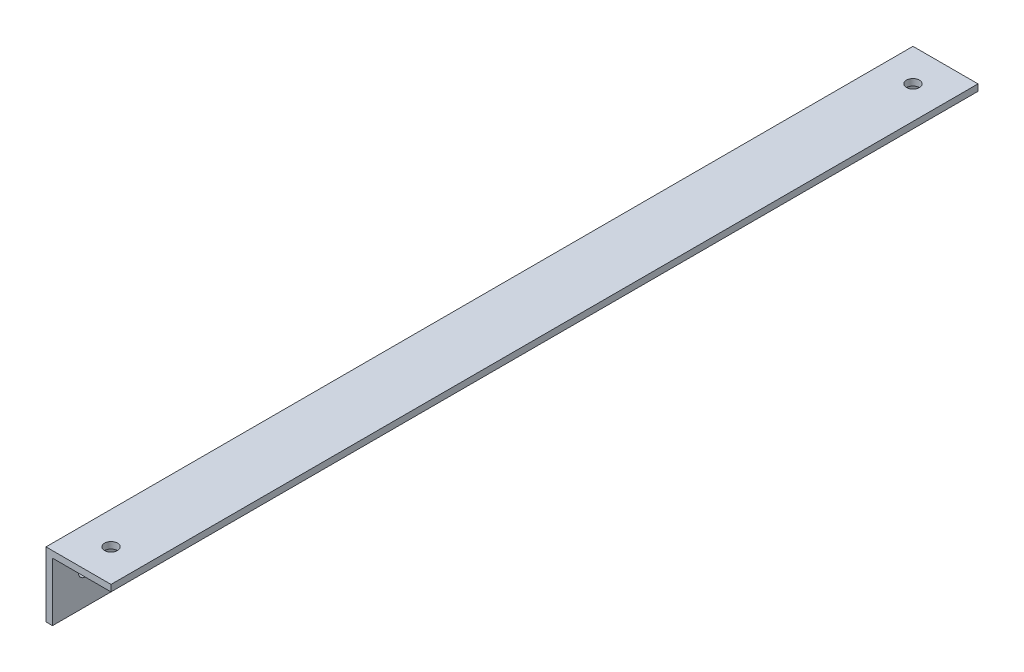
ISO-10303-21;
HEADER;
FILE_DESCRIPTION(('STEP AP214'),'2;1');
FILE_NAME('part.step','',(''),(''),'','','');
FILE_SCHEMA(('AUTOMOTIVE_DESIGN { 1 0 10303 214 1 1 1 1 }'));
ENDSEC;
DATA;
#1=APPLICATION_CONTEXT('core data for automotive mechanical design processes');
#2=APPLICATION_PROTOCOL_DEFINITION('international standard','automotive_design',2000,#1);
#3=PRODUCT_CONTEXT('',#1,'mechanical');
#4=PRODUCT('Part','Part','',(#3));
#5=PRODUCT_RELATED_PRODUCT_CATEGORY('part','',(#4));
#6=PRODUCT_DEFINITION_FORMATION('','',#4);
#7=PRODUCT_DEFINITION_CONTEXT('part definition',#1,'design');
#8=PRODUCT_DEFINITION('design','',#6,#7);
#9=PRODUCT_DEFINITION_SHAPE('','',#8);
#10=(LENGTH_UNIT() NAMED_UNIT(*) SI_UNIT(.MILLI.,.METRE.));
#11=(NAMED_UNIT(*) PLANE_ANGLE_UNIT() SI_UNIT($,.RADIAN.));
#12=(NAMED_UNIT(*) SI_UNIT($,.STERADIAN.) SOLID_ANGLE_UNIT());
#13=UNCERTAINTY_MEASURE_WITH_UNIT(LENGTH_MEASURE(1.E-05),#10,'distance_accuracy_value','');
#14=(GEOMETRIC_REPRESENTATION_CONTEXT(3) GLOBAL_UNCERTAINTY_ASSIGNED_CONTEXT((#13)) GLOBAL_UNIT_ASSIGNED_CONTEXT((#10,
#11,#12)) REPRESENTATION_CONTEXT('',''));
#15=CARTESIAN_POINT('',(0.,0.,0.));
#16=DIRECTION('',(0.,0.,1.));
#17=DIRECTION('',(1.,0.,0.));
#18=AXIS2_PLACEMENT_3D('',#15,#16,#17);
#19=CARTESIAN_POINT('',(-30.,0.,400.));
#20=DIRECTION('',(1.,0.,0.));
#21=DIRECTION('',(0.,0.,-1.));
#22=AXIS2_PLACEMENT_3D('',#19,#20,#21);
#23=PLANE('',#22);
#24=CARTESIAN_POINT('',(-30.,-12.,385.));
#25=DIRECTION('',(-1.,0.,0.));
#26=DIRECTION('',(0.,0.,1.));
#27=AXIS2_PLACEMENT_3D('',#24,#25,#26);
#28=CIRCLE('',#27,3.);
#29=CARTESIAN_POINT('',(-30.,-12.,388.));
#30=VERTEX_POINT('',#29);
#31=EDGE_CURVE('E147',#30,#30,#28,.T.);
#32=ORIENTED_EDGE('',*,*,#31,.F.);
#33=EDGE_LOOP('',(#32));
#34=FACE_BOUND('',#33,.T.);
#35=CARTESIAN_POINT('',(-30.,-12.,15.));
#36=DIRECTION('',(-1.,0.,0.));
#37=DIRECTION('',(0.,0.,1.));
#38=AXIS2_PLACEMENT_3D('',#35,#36,#37);
#39=CIRCLE('',#38,3.);
#40=CARTESIAN_POINT('',(-30.,-12.,18.));
#41=VERTEX_POINT('',#40);
#42=EDGE_CURVE('E136',#41,#41,#39,.T.);
#43=ORIENTED_EDGE('',*,*,#42,.F.);
#44=EDGE_LOOP('',(#43));
#45=FACE_BOUND('',#44,.T.);
#46=DIRECTION('',(0.,1.,0.));
#47=VECTOR('',#46,1.);
#48=CARTESIAN_POINT('',(-30.,0.,0.));
#49=LINE('',#48,#47);
#50=CARTESIAN_POINT('',(-30.,3.,0.));
#51=VERTEX_POINT('',#50);
#52=CARTESIAN_POINT('',(-30.,-27.,0.));
#53=VERTEX_POINT('',#52);
#54=EDGE_CURVE('E116',#51,#53,#49,.F.);
#55=ORIENTED_EDGE('',*,*,#54,.T.);
#56=DIRECTION('',(0.,0.,-1.));
#57=VECTOR('',#56,1.);
#58=CARTESIAN_POINT('',(-30.,-27.,400.));
#59=LINE('',#58,#57);
#60=CARTESIAN_POINT('',(-30.,-27.,400.));
#61=VERTEX_POINT('',#60);
#62=EDGE_CURVE('E11',#61,#53,#59,.T.);
#63=ORIENTED_EDGE('',*,*,#62,.F.);
#64=DIRECTION('',(0.,1.,0.));
#65=VECTOR('',#64,1.);
#66=CARTESIAN_POINT('',(-30.,0.,400.));
#67=LINE('',#66,#65);
#68=CARTESIAN_POINT('',(-30.,3.,400.));
#69=VERTEX_POINT('',#68);
#70=EDGE_CURVE('E81',#69,#61,#67,.F.);
#71=ORIENTED_EDGE('',*,*,#70,.F.);
#72=DIRECTION('',(0.,0.,-1.));
#73=VECTOR('',#72,1.);
#74=CARTESIAN_POINT('',(-30.,3.,400.));
#75=LINE('',#74,#73);
#76=EDGE_CURVE('E112',#69,#51,#75,.T.);
#77=ORIENTED_EDGE('',*,*,#76,.T.);
#78=EDGE_LOOP('',(#55,#63,#71,#77));
#79=FACE_BOUND('',#78,.T.);
#80=ADVANCED_FACE('F33',(#34,#45,#79),#23,.F.);
#81=CARTESIAN_POINT('',(-27.,-27.,400.));
#82=DIRECTION('',(0.,-1.,0.));
#83=DIRECTION('',(0.,0.,-1.));
#84=AXIS2_PLACEMENT_3D('',#81,#82,#83);
#85=PLANE('',#84);
#86=DIRECTION('',(-1.,0.,0.));
#87=VECTOR('',#86,1.);
#88=CARTESIAN_POINT('',(-27.,-27.,0.));
#89=LINE('',#88,#87);
#90=CARTESIAN_POINT('',(-27.,-27.,0.));
#91=VERTEX_POINT('',#90);
#92=EDGE_CURVE('E119',#91,#53,#89,.T.);
#93=ORIENTED_EDGE('',*,*,#92,.F.);
#94=DIRECTION('',(0.,0.,-1.));
#95=VECTOR('',#94,1.);
#96=CARTESIAN_POINT('',(-27.,-27.,400.));
#97=LINE('',#96,#95);
#98=CARTESIAN_POINT('',(-27.,-27.,400.));
#99=VERTEX_POINT('',#98);
#100=EDGE_CURVE('E42',#99,#91,#97,.T.);
#101=ORIENTED_EDGE('',*,*,#100,.F.);
#102=DIRECTION('',(-1.,0.,0.));
#103=VECTOR('',#102,1.);
#104=CARTESIAN_POINT('',(-27.,-27.,400.));
#105=LINE('',#104,#103);
#106=EDGE_CURVE('E158',#99,#61,#105,.T.);
#107=ORIENTED_EDGE('',*,*,#106,.T.);
#108=ORIENTED_EDGE('',*,*,#62,.T.);
#109=EDGE_LOOP('',(#93,#101,#107,#108));
#110=FACE_BOUND('',#109,.T.);
#111=ADVANCED_FACE('F182',(#110),#85,.T.);
#112=CARTESIAN_POINT('',(-27.,0.,400.));
#113=DIRECTION('',(1.,0.,0.));
#114=DIRECTION('',(0.,0.,-1.));
#115=AXIS2_PLACEMENT_3D('',#112,#113,#114);
#116=PLANE('',#115);
#117=CARTESIAN_POINT('',(-27.,-12.,385.));
#118=DIRECTION('',(1.,0.,0.));
#119=DIRECTION('',(0.,0.,-1.));
#120=AXIS2_PLACEMENT_3D('',#117,#118,#119);
#121=CIRCLE('',#120,3.);
#122=CARTESIAN_POINT('',(-27.,-12.,382.));
#123=VERTEX_POINT('',#122);
#124=EDGE_CURVE('E36',#123,#123,#121,.T.);
#125=ORIENTED_EDGE('',*,*,#124,.F.);
#126=EDGE_LOOP('',(#125));
#127=FACE_BOUND('',#126,.T.);
#128=CARTESIAN_POINT('',(-27.,-12.,15.));
#129=DIRECTION('',(1.,0.,0.));
#130=DIRECTION('',(0.,0.,-1.));
#131=AXIS2_PLACEMENT_3D('',#128,#129,#130);
#132=CIRCLE('',#131,3.);
#133=CARTESIAN_POINT('',(-27.,-12.,12.));
#134=VERTEX_POINT('',#133);
#135=EDGE_CURVE('E133',#134,#134,#132,.T.);
#136=ORIENTED_EDGE('',*,*,#135,.F.);
#137=EDGE_LOOP('',(#136));
#138=FACE_BOUND('',#137,.T.);
#139=DIRECTION('',(0.,-1.,0.));
#140=VECTOR('',#139,1.);
#141=CARTESIAN_POINT('',(-27.,0.,0.));
#142=LINE('',#141,#140);
#143=CARTESIAN_POINT('',(-27.,0.,0.));
#144=VERTEX_POINT('',#143);
#145=EDGE_CURVE('E123',#144,#91,#142,.T.);
#146=ORIENTED_EDGE('',*,*,#145,.F.);
#147=DIRECTION('',(0.,0.,-1.));
#148=VECTOR('',#147,1.);
#149=CARTESIAN_POINT('',(-27.,0.,400.));
#150=LINE('',#149,#148);
#151=CARTESIAN_POINT('',(-27.,0.,400.));
#152=VERTEX_POINT('',#151);
#153=EDGE_CURVE('E102',#152,#144,#150,.T.);
#154=ORIENTED_EDGE('',*,*,#153,.F.);
#155=DIRECTION('',(0.,-1.,0.));
#156=VECTOR('',#155,1.);
#157=CARTESIAN_POINT('',(-27.,0.,400.));
#158=LINE('',#157,#156);
#159=EDGE_CURVE('E108',#152,#99,#158,.T.);
#160=ORIENTED_EDGE('',*,*,#159,.T.);
#161=ORIENTED_EDGE('',*,*,#100,.T.);
#162=EDGE_LOOP('',(#146,#154,#160,#161));
#163=FACE_BOUND('',#162,.T.);
#164=ADVANCED_FACE('F162',(#127,#138,#163),#116,.T.);
#165=CARTESIAN_POINT('',(0.,0.,400.));
#166=DIRECTION('',(0.,-1.,0.));
#167=DIRECTION('',(0.,0.,-1.));
#168=AXIS2_PLACEMENT_3D('',#165,#166,#167);
#169=PLANE('',#168);
#170=CARTESIAN_POINT('',(-15.,0.,385.));
#171=DIRECTION('',(0.,-1.,0.));
#172=DIRECTION('',(0.,0.,-1.));
#173=AXIS2_PLACEMENT_3D('',#170,#171,#172);
#174=CIRCLE('',#173,3.);
#175=CARTESIAN_POINT('',(-15.,0.,382.));
#176=VERTEX_POINT('',#175);
#177=EDGE_CURVE('E140',#176,#176,#174,.T.);
#178=ORIENTED_EDGE('',*,*,#177,.F.);
#179=EDGE_LOOP('',(#178));
#180=FACE_BOUND('',#179,.T.);
#181=CARTESIAN_POINT('',(-15.,0.,15.));
#182=DIRECTION('',(0.,-1.,0.));
#183=DIRECTION('',(0.,0.,-1.));
#184=AXIS2_PLACEMENT_3D('',#181,#182,#183);
#185=CIRCLE('',#184,3.);
#186=CARTESIAN_POINT('',(-15.,0.,12.));
#187=VERTEX_POINT('',#186);
#188=EDGE_CURVE('E120',#187,#187,#185,.T.);
#189=ORIENTED_EDGE('',*,*,#188,.F.);
#190=EDGE_LOOP('',(#189));
#191=FACE_BOUND('',#190,.T.);
#192=DIRECTION('',(-1.,0.,0.));
#193=VECTOR('',#192,1.);
#194=CARTESIAN_POINT('',(0.,0.,0.));
#195=LINE('',#194,#193);
#196=CARTESIAN_POINT('',(0.,0.,0.));
#197=VERTEX_POINT('',#196);
#198=EDGE_CURVE('E97',#197,#144,#195,.T.);
#199=ORIENTED_EDGE('',*,*,#198,.F.);
#200=DIRECTION('',(0.,0.,-1.));
#201=VECTOR('',#200,1.);
#202=CARTESIAN_POINT('',(0.,0.,400.));
#203=LINE('',#202,#201);
#204=CARTESIAN_POINT('',(0.,0.,400.));
#205=VERTEX_POINT('',#204);
#206=EDGE_CURVE('E92',#205,#197,#203,.T.);
#207=ORIENTED_EDGE('',*,*,#206,.F.);
#208=DIRECTION('',(-1.,0.,0.));
#209=VECTOR('',#208,1.);
#210=CARTESIAN_POINT('',(0.,0.,400.));
#211=LINE('',#210,#209);
#212=EDGE_CURVE('E95',#205,#152,#211,.T.);
#213=ORIENTED_EDGE('',*,*,#212,.T.);
#214=ORIENTED_EDGE('',*,*,#153,.T.);
#215=EDGE_LOOP('',(#199,#207,#213,#214));
#216=FACE_BOUND('',#215,.T.);
#217=ADVANCED_FACE('F94',(#180,#191,#216),#169,.T.);
#218=CARTESIAN_POINT('',(0.,3.,400.));
#219=DIRECTION('',(1.,0.,0.));
#220=DIRECTION('',(0.,0.,-1.));
#221=AXIS2_PLACEMENT_3D('',#218,#219,#220);
#222=PLANE('',#221);
#223=DIRECTION('',(0.,-1.,0.));
#224=VECTOR('',#223,1.);
#225=CARTESIAN_POINT('',(0.,3.,0.));
#226=LINE('',#225,#224);
#227=CARTESIAN_POINT('',(0.,3.,0.));
#228=VERTEX_POINT('',#227);
#229=EDGE_CURVE('E127',#228,#197,#226,.T.);
#230=ORIENTED_EDGE('',*,*,#229,.F.);
#231=DIRECTION('',(0.,0.,-1.));
#232=VECTOR('',#231,1.);
#233=CARTESIAN_POINT('',(0.,3.,400.));
#234=LINE('',#233,#232);
#235=CARTESIAN_POINT('',(0.,3.,400.));
#236=VERTEX_POINT('',#235);
#237=EDGE_CURVE('E72',#236,#228,#234,.T.);
#238=ORIENTED_EDGE('',*,*,#237,.F.);
#239=DIRECTION('',(0.,-1.,0.));
#240=VECTOR('',#239,1.);
#241=CARTESIAN_POINT('',(0.,3.,400.));
#242=LINE('',#241,#240);
#243=EDGE_CURVE('E106',#236,#205,#242,.T.);
#244=ORIENTED_EDGE('',*,*,#243,.T.);
#245=ORIENTED_EDGE('',*,*,#206,.T.);
#246=EDGE_LOOP('',(#230,#238,#244,#245));
#247=FACE_BOUND('',#246,.T.);
#248=ADVANCED_FACE('F110',(#247),#222,.T.);
#249=CARTESIAN_POINT('',(0.,3.,400.));
#250=DIRECTION('',(0.,-1.,0.));
#251=DIRECTION('',(0.,0.,-1.));
#252=AXIS2_PLACEMENT_3D('',#249,#250,#251);
#253=PLANE('',#252);
#254=CARTESIAN_POINT('',(-15.,3.,385.));
#255=DIRECTION('',(0.,1.,0.));
#256=DIRECTION('',(0.,0.,1.));
#257=AXIS2_PLACEMENT_3D('',#254,#255,#256);
#258=CIRCLE('',#257,3.);
#259=CARTESIAN_POINT('',(-15.,3.,388.));
#260=VERTEX_POINT('',#259);
#261=EDGE_CURVE('E135',#260,#260,#258,.T.);
#262=ORIENTED_EDGE('',*,*,#261,.F.);
#263=EDGE_LOOP('',(#262));
#264=FACE_BOUND('',#263,.T.);
#265=CARTESIAN_POINT('',(-15.,3.,15.));
#266=DIRECTION('',(0.,1.,0.));
#267=DIRECTION('',(0.,0.,1.));
#268=AXIS2_PLACEMENT_3D('',#265,#266,#267);
#269=CIRCLE('',#268,3.);
#270=CARTESIAN_POINT('',(-15.,3.,18.));
#271=VERTEX_POINT('',#270);
#272=EDGE_CURVE('E152',#271,#271,#269,.T.);
#273=ORIENTED_EDGE('',*,*,#272,.F.);
#274=EDGE_LOOP('',(#273));
#275=FACE_BOUND('',#274,.T.);
#276=DIRECTION('',(1.,0.,0.));
#277=VECTOR('',#276,1.);
#278=CARTESIAN_POINT('',(0.,3.,0.));
#279=LINE('',#278,#277);
#280=EDGE_CURVE('E75',#228,#51,#279,.F.);
#281=ORIENTED_EDGE('',*,*,#280,.T.);
#282=ORIENTED_EDGE('',*,*,#76,.F.);
#283=DIRECTION('',(1.,0.,0.));
#284=VECTOR('',#283,1.);
#285=CARTESIAN_POINT('',(0.,3.,400.));
#286=LINE('',#285,#284);
#287=EDGE_CURVE('E51',#236,#69,#286,.F.);
#288=ORIENTED_EDGE('',*,*,#287,.F.);
#289=ORIENTED_EDGE('',*,*,#237,.T.);
#290=EDGE_LOOP('',(#281,#282,#288,#289));
#291=FACE_BOUND('',#290,.T.);
#292=ADVANCED_FACE('F168',(#264,#275,#291),#253,.F.);
#293=CARTESIAN_POINT('',(0.,0.,400.));
#294=DIRECTION('',(0.,0.,1.));
#295=DIRECTION('',(1.,0.,0.));
#296=AXIS2_PLACEMENT_3D('',#293,#294,#295);
#297=PLANE('',#296);
#298=ORIENTED_EDGE('',*,*,#70,.T.);
#299=ORIENTED_EDGE('',*,*,#106,.F.);
#300=ORIENTED_EDGE('',*,*,#159,.F.);
#301=ORIENTED_EDGE('',*,*,#212,.F.);
#302=ORIENTED_EDGE('',*,*,#243,.F.);
#303=ORIENTED_EDGE('',*,*,#287,.T.);
#304=EDGE_LOOP('',(#298,#299,#300,#301,#302,#303));
#305=FACE_BOUND('',#304,.T.);
#306=ADVANCED_FACE('F105',(#305),#297,.T.);
#307=CARTESIAN_POINT('',(0.,0.,0.));
#308=DIRECTION('',(0.,0.,1.));
#309=DIRECTION('',(1.,0.,0.));
#310=AXIS2_PLACEMENT_3D('',#307,#308,#309);
#311=PLANE('',#310);
#312=ORIENTED_EDGE('',*,*,#54,.F.);
#313=ORIENTED_EDGE('',*,*,#280,.F.);
#314=ORIENTED_EDGE('',*,*,#229,.T.);
#315=ORIENTED_EDGE('',*,*,#198,.T.);
#316=ORIENTED_EDGE('',*,*,#145,.T.);
#317=ORIENTED_EDGE('',*,*,#92,.T.);
#318=EDGE_LOOP('',(#312,#313,#314,#315,#316,#317));
#319=FACE_BOUND('',#318,.T.);
#320=ADVANCED_FACE('F166',(#319),#311,.F.);
#321=CARTESIAN_POINT('',(-15.,-7.,15.));
#322=DIRECTION('',(0.,1.,0.));
#323=DIRECTION('',(0.,0.,1.));
#324=AXIS2_PLACEMENT_3D('',#321,#322,#323);
#325=CYLINDRICAL_SURFACE('',#324,3.);
#326=ORIENTED_EDGE('',*,*,#188,.T.);
#327=EDGE_LOOP('',(#326));
#328=FACE_BOUND('',#327,.T.);
#329=ORIENTED_EDGE('',*,*,#272,.T.);
#330=EDGE_LOOP('',(#329));
#331=FACE_BOUND('',#330,.T.);
#332=ADVANCED_FACE('F205',(#328,#331),#325,.F.);
#333=CARTESIAN_POINT('',(-15.,-7.,385.));
#334=DIRECTION('',(0.,1.,0.));
#335=DIRECTION('',(0.,0.,1.));
#336=AXIS2_PLACEMENT_3D('',#333,#334,#335);
#337=CYLINDRICAL_SURFACE('',#336,3.);
#338=ORIENTED_EDGE('',*,*,#177,.T.);
#339=EDGE_LOOP('',(#338));
#340=FACE_BOUND('',#339,.T.);
#341=ORIENTED_EDGE('',*,*,#261,.T.);
#342=EDGE_LOOP('',(#341));
#343=FACE_BOUND('',#342,.T.);
#344=ADVANCED_FACE('F200',(#340,#343),#337,.F.);
#345=CARTESIAN_POINT('',(-20.,-12.,15.));
#346=DIRECTION('',(-1.,0.,0.));
#347=DIRECTION('',(0.,0.,1.));
#348=AXIS2_PLACEMENT_3D('',#345,#346,#347);
#349=CYLINDRICAL_SURFACE('',#348,3.);
#350=ORIENTED_EDGE('',*,*,#135,.T.);
#351=EDGE_LOOP('',(#350));
#352=FACE_BOUND('',#351,.T.);
#353=ORIENTED_EDGE('',*,*,#42,.T.);
#354=EDGE_LOOP('',(#353));
#355=FACE_BOUND('',#354,.T.);
#356=ADVANCED_FACE('F194',(#352,#355),#349,.F.);
#357=CARTESIAN_POINT('',(-20.,-12.,385.));
#358=DIRECTION('',(-1.,0.,0.));
#359=DIRECTION('',(0.,0.,1.));
#360=AXIS2_PLACEMENT_3D('',#357,#358,#359);
#361=CYLINDRICAL_SURFACE('',#360,3.);
#362=ORIENTED_EDGE('',*,*,#124,.T.);
#363=EDGE_LOOP('',(#362));
#364=FACE_BOUND('',#363,.T.);
#365=ORIENTED_EDGE('',*,*,#31,.T.);
#366=EDGE_LOOP('',(#365));
#367=FACE_BOUND('',#366,.T.);
#368=ADVANCED_FACE('F192',(#364,#367),#361,.F.);
#369=CLOSED_SHELL('',(#80,#111,#164,#217,#248,#292,#306,#320,#332,#344,#356,#368));
#370=MANIFOLD_SOLID_BREP('B2',#369);
#371=ADVANCED_BREP_SHAPE_REPRESENTATION('',(#18,#370),#14);
#372=SHAPE_DEFINITION_REPRESENTATION(#9,#371);
ENDSEC;
END-ISO-10303-21;
